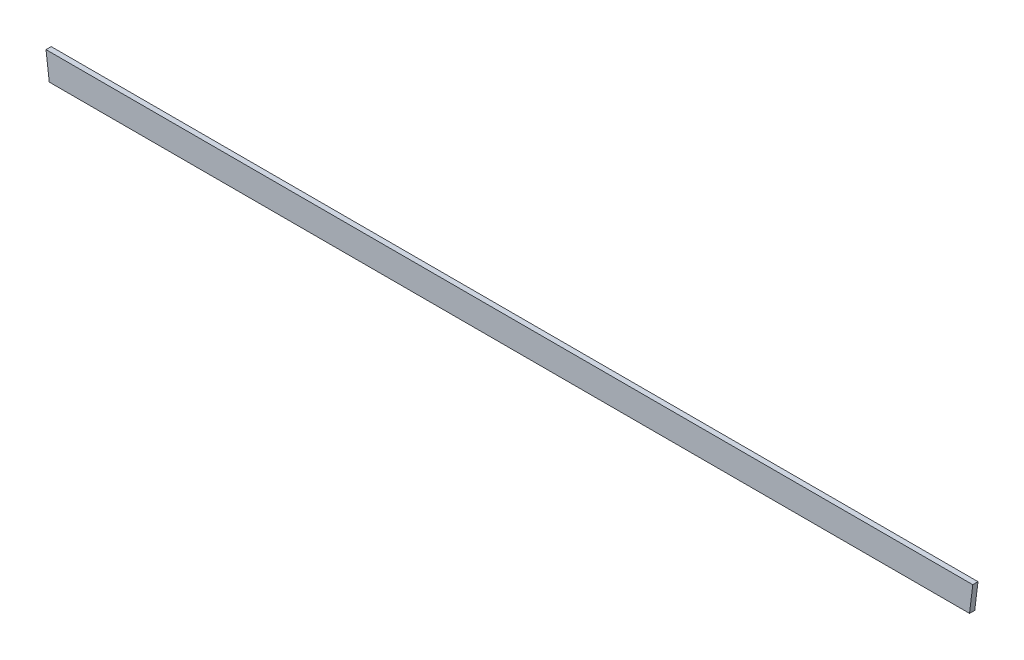
ISO-10303-21;
HEADER;
FILE_DESCRIPTION(('STEP AP214'),'2;1');
FILE_NAME('part.step','',(''),(''),'','','');
FILE_SCHEMA(('AUTOMOTIVE_DESIGN { 1 0 10303 214 1 1 1 1 }'));
ENDSEC;
DATA;
#1=APPLICATION_CONTEXT('core data for automotive mechanical design processes');
#2=APPLICATION_PROTOCOL_DEFINITION('international standard','automotive_design',2000,#1);
#3=PRODUCT_CONTEXT('',#1,'mechanical');
#4=PRODUCT('Part','Part','',(#3));
#5=PRODUCT_RELATED_PRODUCT_CATEGORY('part','',(#4));
#6=PRODUCT_DEFINITION_FORMATION('','',#4);
#7=PRODUCT_DEFINITION_CONTEXT('part definition',#1,'design');
#8=PRODUCT_DEFINITION('design','',#6,#7);
#9=PRODUCT_DEFINITION_SHAPE('','',#8);
#10=(LENGTH_UNIT() NAMED_UNIT(*) SI_UNIT(.MILLI.,.METRE.));
#11=(NAMED_UNIT(*) PLANE_ANGLE_UNIT() SI_UNIT($,.RADIAN.));
#12=(NAMED_UNIT(*) SI_UNIT($,.STERADIAN.) SOLID_ANGLE_UNIT());
#13=UNCERTAINTY_MEASURE_WITH_UNIT(LENGTH_MEASURE(1.E-05),#10,'distance_accuracy_value','');
#14=(GEOMETRIC_REPRESENTATION_CONTEXT(3) GLOBAL_UNCERTAINTY_ASSIGNED_CONTEXT((#13)) GLOBAL_UNIT_ASSIGNED_CONTEXT((#10,
#11,#12)) REPRESENTATION_CONTEXT('',''));
#15=CARTESIAN_POINT('',(0.,0.,0.));
#16=DIRECTION('',(0.,0.,1.));
#17=DIRECTION('',(1.,0.,0.));
#18=AXIS2_PLACEMENT_3D('',#15,#16,#17);
#19=CARTESIAN_POINT('',(-881.492544306132,-114.3,10.));
#20=DIRECTION('',(0.992546151641322,0.121869343405147,0.));
#21=DIRECTION('',(-0.121869343405147,0.992546151641322,0.));
#22=AXIS2_PLACEMENT_3D('',#19,#20,#21);
#23=PLANE('',#22);
#24=DIRECTION('',(0.121869343405147,-0.992546151641322,0.));
#25=VECTOR('',#24,1.);
#26=CARTESIAN_POINT('',(-881.492544306132,-114.3,0.));
#27=LINE('',#26,#25);
#28=CARTESIAN_POINT('',(-887.73,-63.4999999999998,0.));
#29=VERTEX_POINT('',#28);
#30=CARTESIAN_POINT('',(-881.492544306132,-114.3,0.));
#31=VERTEX_POINT('',#30);
#32=EDGE_CURVE('E98',#29,#31,#27,.T.);
#33=ORIENTED_EDGE('',*,*,#32,.T.);
#34=DIRECTION('',(0.,0.,-1.));
#35=VECTOR('',#34,1.);
#36=CARTESIAN_POINT('',(-881.492544306132,-114.3,10.));
#37=LINE('',#36,#35);
#38=CARTESIAN_POINT('',(-881.492544306132,-114.3,10.));
#39=VERTEX_POINT('',#38);
#40=EDGE_CURVE('E11',#39,#31,#37,.T.);
#41=ORIENTED_EDGE('',*,*,#40,.F.);
#42=DIRECTION('',(0.121869343405147,-0.992546151641322,0.));
#43=VECTOR('',#42,1.);
#44=CARTESIAN_POINT('',(-881.492544306132,-114.3,10.));
#45=LINE('',#44,#43);
#46=CARTESIAN_POINT('',(-887.73,-63.4999999999998,10.));
#47=VERTEX_POINT('',#46);
#48=EDGE_CURVE('E86',#47,#39,#45,.T.);
#49=ORIENTED_EDGE('',*,*,#48,.F.);
#50=DIRECTION('',(0.,0.,-1.));
#51=VECTOR('',#50,1.);
#52=CARTESIAN_POINT('',(-887.73,-63.4999999999998,10.));
#53=LINE('',#52,#51);
#54=EDGE_CURVE('E94',#47,#29,#53,.T.);
#55=ORIENTED_EDGE('',*,*,#54,.T.);
#56=EDGE_LOOP('',(#33,#41,#49,#55));
#57=FACE_BOUND('',#56,.T.);
#58=ADVANCED_FACE('F35',(#57),#23,.F.);
#59=CARTESIAN_POINT('',(-881.492544306132,-114.3,10.));
#60=DIRECTION('',(0.,1.,0.));
#61=DIRECTION('',(-1.,0.,0.));
#62=AXIS2_PLACEMENT_3D('',#59,#60,#61);
#63=PLANE('',#62);
#64=DIRECTION('',(1.,0.,0.));
#65=VECTOR('',#64,1.);
#66=CARTESIAN_POINT('',(-881.492544306132,-114.3,0.));
#67=LINE('',#66,#65);
#68=CARTESIAN_POINT('',(881.492544306133,-114.3,0.));
#69=VERTEX_POINT('',#68);
#70=EDGE_CURVE('E90',#31,#69,#67,.T.);
#71=ORIENTED_EDGE('',*,*,#70,.T.);
#72=DIRECTION('',(0.,0.,-1.));
#73=VECTOR('',#72,1.);
#74=CARTESIAN_POINT('',(881.492544306133,-114.3,10.));
#75=LINE('',#74,#73);
#76=CARTESIAN_POINT('',(881.492544306133,-114.3,10.));
#77=VERTEX_POINT('',#76);
#78=EDGE_CURVE('E43',#77,#69,#75,.T.);
#79=ORIENTED_EDGE('',*,*,#78,.F.);
#80=DIRECTION('',(1.,0.,0.));
#81=VECTOR('',#80,1.);
#82=CARTESIAN_POINT('',(-881.492544306132,-114.3,10.));
#83=LINE('',#82,#81);
#84=EDGE_CURVE('E81',#39,#77,#83,.T.);
#85=ORIENTED_EDGE('',*,*,#84,.F.);
#86=ORIENTED_EDGE('',*,*,#40,.T.);
#87=EDGE_LOOP('',(#71,#79,#85,#86));
#88=FACE_BOUND('',#87,.T.);
#89=ADVANCED_FACE('F89',(#88),#63,.F.);
#90=CARTESIAN_POINT('',(887.73,-63.4999999999998,10.));
#91=DIRECTION('',(-0.992546151641322,0.121869343405146,0.));
#92=DIRECTION('',(-0.121869343405146,-0.992546151641322,0.));
#93=AXIS2_PLACEMENT_3D('',#90,#91,#92);
#94=PLANE('',#93);
#95=DIRECTION('',(0.121869343405146,0.992546151641322,0.));
#96=VECTOR('',#95,1.);
#97=CARTESIAN_POINT('',(887.73,-63.4999999999998,0.));
#98=LINE('',#97,#96);
#99=CARTESIAN_POINT('',(887.73,-63.4999999999998,0.));
#100=VERTEX_POINT('',#99);
#101=EDGE_CURVE('E68',#69,#100,#98,.T.);
#102=ORIENTED_EDGE('',*,*,#101,.T.);
#103=DIRECTION('',(0.,0.,-1.));
#104=VECTOR('',#103,1.);
#105=CARTESIAN_POINT('',(887.73,-63.4999999999998,10.));
#106=LINE('',#105,#104);
#107=CARTESIAN_POINT('',(887.73,-63.4999999999998,10.));
#108=VERTEX_POINT('',#107);
#109=EDGE_CURVE('E91',#108,#100,#106,.T.);
#110=ORIENTED_EDGE('',*,*,#109,.F.);
#111=DIRECTION('',(0.121869343405146,0.992546151641322,0.));
#112=VECTOR('',#111,1.);
#113=CARTESIAN_POINT('',(887.73,-63.4999999999998,10.));
#114=LINE('',#113,#112);
#115=EDGE_CURVE('E84',#77,#108,#114,.T.);
#116=ORIENTED_EDGE('',*,*,#115,.F.);
#117=ORIENTED_EDGE('',*,*,#78,.T.);
#118=EDGE_LOOP('',(#102,#110,#116,#117));
#119=FACE_BOUND('',#118,.T.);
#120=ADVANCED_FACE('F92',(#119),#94,.F.);
#121=CARTESIAN_POINT('',(887.73,-63.4999999999998,10.));
#122=DIRECTION('',(0.,-1.,0.));
#123=DIRECTION('',(0.,0.,-1.));
#124=AXIS2_PLACEMENT_3D('',#121,#122,#123);
#125=PLANE('',#124);
#126=DIRECTION('',(-1.,0.,0.));
#127=VECTOR('',#126,1.);
#128=CARTESIAN_POINT('',(887.73,-63.4999999999998,0.));
#129=LINE('',#128,#127);
#130=EDGE_CURVE('E74',#100,#29,#129,.T.);
#131=ORIENTED_EDGE('',*,*,#130,.T.);
#132=ORIENTED_EDGE('',*,*,#54,.F.);
#133=DIRECTION('',(-1.,0.,0.));
#134=VECTOR('',#133,1.);
#135=CARTESIAN_POINT('',(887.73,-63.4999999999998,10.));
#136=LINE('',#135,#134);
#137=EDGE_CURVE('E51',#108,#47,#136,.T.);
#138=ORIENTED_EDGE('',*,*,#137,.F.);
#139=ORIENTED_EDGE('',*,*,#109,.T.);
#140=EDGE_LOOP('',(#131,#132,#138,#139));
#141=FACE_BOUND('',#140,.T.);
#142=ADVANCED_FACE('F105',(#141),#125,.F.);
#143=CARTESIAN_POINT('',(0.,0.,10.));
#144=DIRECTION('',(0.,0.,1.));
#145=DIRECTION('',(1.,0.,0.));
#146=AXIS2_PLACEMENT_3D('',#143,#144,#145);
#147=PLANE('',#146);
#148=ORIENTED_EDGE('',*,*,#48,.T.);
#149=ORIENTED_EDGE('',*,*,#84,.T.);
#150=ORIENTED_EDGE('',*,*,#115,.T.);
#151=ORIENTED_EDGE('',*,*,#137,.T.);
#152=EDGE_LOOP('',(#148,#149,#150,#151));
#153=FACE_BOUND('',#152,.T.);
#154=ADVANCED_FACE('F82',(#153),#147,.T.);
#155=CARTESIAN_POINT('',(0.,0.,0.));
#156=DIRECTION('',(0.,0.,1.));
#157=DIRECTION('',(1.,0.,0.));
#158=AXIS2_PLACEMENT_3D('',#155,#156,#157);
#159=PLANE('',#158);
#160=ORIENTED_EDGE('',*,*,#32,.F.);
#161=ORIENTED_EDGE('',*,*,#130,.F.);
#162=ORIENTED_EDGE('',*,*,#101,.F.);
#163=ORIENTED_EDGE('',*,*,#70,.F.);
#164=EDGE_LOOP('',(#160,#161,#162,#163));
#165=FACE_BOUND('',#164,.T.);
#166=ADVANCED_FACE('F108',(#165),#159,.F.);
#167=CLOSED_SHELL('',(#58,#89,#120,#142,#154,#166));
#168=MANIFOLD_SOLID_BREP('B2',#167);
#169=ADVANCED_BREP_SHAPE_REPRESENTATION('',(#18,#168),#14);
#170=SHAPE_DEFINITION_REPRESENTATION(#9,#169);
ENDSEC;
END-ISO-10303-21;
